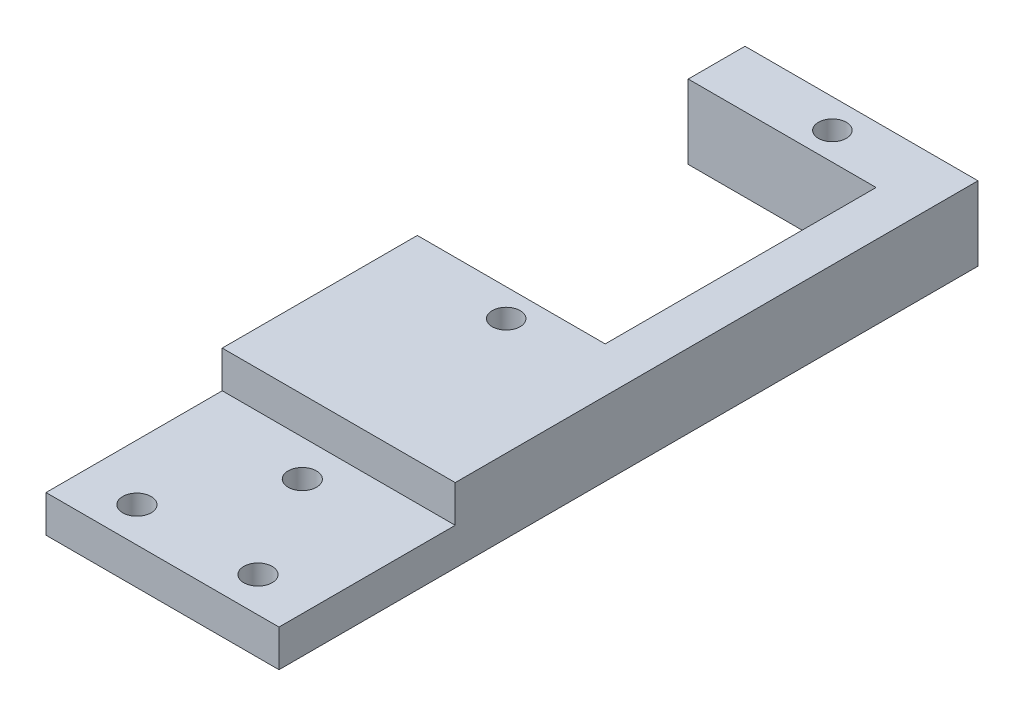
ISO-10303-21;
HEADER;
FILE_DESCRIPTION(('STEP AP214'),'2;1');
FILE_NAME('part.step','',(''),(''),'','','');
FILE_SCHEMA(('AUTOMOTIVE_DESIGN { 1 0 10303 214 1 1 1 1 }'));
ENDSEC;
DATA;
#1=APPLICATION_CONTEXT('core data for automotive mechanical design processes');
#2=APPLICATION_PROTOCOL_DEFINITION('international standard','automotive_design',2000,#1);
#3=PRODUCT_CONTEXT('',#1,'mechanical');
#4=PRODUCT('Part','Part','',(#3));
#5=PRODUCT_RELATED_PRODUCT_CATEGORY('part','',(#4));
#6=PRODUCT_DEFINITION_FORMATION('','',#4);
#7=PRODUCT_DEFINITION_CONTEXT('part definition',#1,'design');
#8=PRODUCT_DEFINITION('design','',#6,#7);
#9=PRODUCT_DEFINITION_SHAPE('','',#8);
#10=(LENGTH_UNIT() NAMED_UNIT(*) SI_UNIT(.MILLI.,.METRE.));
#11=(NAMED_UNIT(*) PLANE_ANGLE_UNIT() SI_UNIT($,.RADIAN.));
#12=(NAMED_UNIT(*) SI_UNIT($,.STERADIAN.) SOLID_ANGLE_UNIT());
#13=UNCERTAINTY_MEASURE_WITH_UNIT(LENGTH_MEASURE(1.E-05),#10,'distance_accuracy_value','');
#14=(GEOMETRIC_REPRESENTATION_CONTEXT(3) GLOBAL_UNCERTAINTY_ASSIGNED_CONTEXT((#13)) GLOBAL_UNIT_ASSIGNED_CONTEXT((#10,
#11,#12)) REPRESENTATION_CONTEXT('',''));
#15=CARTESIAN_POINT('',(0.,0.,0.));
#16=DIRECTION('',(0.,0.,1.));
#17=DIRECTION('',(1.,0.,0.));
#18=AXIS2_PLACEMENT_3D('',#15,#16,#17);
#19=CARTESIAN_POINT('',(0.,6.35,0.));
#20=DIRECTION('',(1.,0.,0.));
#21=DIRECTION('',(0.,0.,-1.));
#22=AXIS2_PLACEMENT_3D('',#19,#20,#21);
#23=PLANE('',#22);
#24=DIRECTION('',(0.,0.,1.));
#25=VECTOR('',#24,1.);
#26=CARTESIAN_POINT('',(0.,0.,0.));
#27=LINE('',#26,#25);
#28=CARTESIAN_POINT('',(0.,0.,0.));
#29=VERTEX_POINT('',#28);
#30=CARTESIAN_POINT('',(0.,0.,4.873));
#31=VERTEX_POINT('',#30);
#32=EDGE_CURVE('E151',#29,#31,#27,.T.);
#33=ORIENTED_EDGE('',*,*,#32,.T.);
#34=DIRECTION('',(0.,1.,0.));
#35=VECTOR('',#34,1.);
#36=CARTESIAN_POINT('',(0.,0.,4.873));
#37=LINE('',#36,#35);
#38=CARTESIAN_POINT('',(0.,6.35,4.873));
#39=VERTEX_POINT('',#38);
#40=EDGE_CURVE('E152',#31,#39,#37,.T.);
#41=ORIENTED_EDGE('',*,*,#40,.T.);
#42=DIRECTION('',(0.,0.,1.));
#43=VECTOR('',#42,1.);
#44=CARTESIAN_POINT('',(0.,6.35,0.));
#45=LINE('',#44,#43);
#46=CARTESIAN_POINT('',(0.,6.35,0.));
#47=VERTEX_POINT('',#46);
#48=EDGE_CURVE('E248',#47,#39,#45,.T.);
#49=ORIENTED_EDGE('',*,*,#48,.F.);
#50=DIRECTION('',(0.,-1.,0.));
#51=VECTOR('',#50,1.);
#52=CARTESIAN_POINT('',(0.,6.35,0.));
#53=LINE('',#52,#51);
#54=EDGE_CURVE('E171',#47,#29,#53,.T.);
#55=ORIENTED_EDGE('',*,*,#54,.T.);
#56=EDGE_LOOP('',(#33,#41,#49,#55));
#57=FACE_BOUND('',#56,.T.);
#58=ADVANCED_FACE('F39',(#57),#23,.F.);
#59=DIRECTION('',(0.,0.,-1.));
#60=VECTOR('',#59,1.);
#61=CARTESIAN_POINT('',(0.,3.175,60.));
#62=LINE('',#61,#60);
#63=CARTESIAN_POINT('',(0.,3.175,60.));
#64=VERTEX_POINT('',#63);
#65=CARTESIAN_POINT('',(0.,3.175,44.873));
#66=VERTEX_POINT('',#65);
#67=EDGE_CURVE('E121',#64,#66,#62,.T.);
#68=ORIENTED_EDGE('',*,*,#67,.T.);
#69=DIRECTION('',(0.,1.,0.));
#70=VECTOR('',#69,1.);
#71=CARTESIAN_POINT('',(0.,6.35,44.873));
#72=LINE('',#71,#70);
#73=CARTESIAN_POINT('',(0.,6.35,44.873));
#74=VERTEX_POINT('',#73);
#75=EDGE_CURVE('E133',#66,#74,#72,.T.);
#76=ORIENTED_EDGE('',*,*,#75,.T.);
#77=CARTESIAN_POINT('',(0.,6.35,28.127));
#78=VERTEX_POINT('',#77);
#79=EDGE_CURVE('E170',#78,#74,#45,.T.);
#80=ORIENTED_EDGE('',*,*,#79,.F.);
#81=DIRECTION('',(0.,1.,0.));
#82=VECTOR('',#81,1.);
#83=CARTESIAN_POINT('',(0.,0.,28.127));
#84=LINE('',#83,#82);
#85=CARTESIAN_POINT('',(0.,0.,28.127));
#86=VERTEX_POINT('',#85);
#87=EDGE_CURVE('E147',#86,#78,#84,.T.);
#88=ORIENTED_EDGE('',*,*,#87,.F.);
#89=CARTESIAN_POINT('',(0.,0.,60.));
#90=VERTEX_POINT('',#89);
#91=EDGE_CURVE('E144',#86,#90,#27,.T.);
#92=ORIENTED_EDGE('',*,*,#91,.T.);
#93=DIRECTION('',(0.,-1.,0.));
#94=VECTOR('',#93,1.);
#95=CARTESIAN_POINT('',(0.,6.35,60.));
#96=LINE('',#95,#94);
#97=EDGE_CURVE('E11',#64,#90,#96,.T.);
#98=ORIENTED_EDGE('',*,*,#97,.F.);
#99=EDGE_LOOP('',(#68,#76,#80,#88,#92,#98));
#100=FACE_BOUND('',#99,.T.);
#101=ADVANCED_FACE('F41',(#100),#23,.F.);
#102=CARTESIAN_POINT('',(0.,6.35,60.));
#103=DIRECTION('',(0.,0.,-1.));
#104=DIRECTION('',(-1.,0.,0.));
#105=AXIS2_PLACEMENT_3D('',#102,#103,#104);
#106=PLANE('',#105);
#107=DIRECTION('',(0.,-1.,0.));
#108=VECTOR('',#107,1.);
#109=CARTESIAN_POINT('',(20.,6.35,60.));
#110=LINE('',#109,#108);
#111=CARTESIAN_POINT('',(20.,3.175,60.));
#112=VERTEX_POINT('',#111);
#113=CARTESIAN_POINT('',(20.,0.,60.));
#114=VERTEX_POINT('',#113);
#115=EDGE_CURVE('E48',#112,#114,#110,.T.);
#116=ORIENTED_EDGE('',*,*,#115,.F.);
#117=DIRECTION('',(1.,0.,0.));
#118=VECTOR('',#117,1.);
#119=CARTESIAN_POINT('',(0.,3.175,60.));
#120=LINE('',#119,#118);
#121=EDGE_CURVE('E125',#64,#112,#120,.T.);
#122=ORIENTED_EDGE('',*,*,#121,.F.);
#123=ORIENTED_EDGE('',*,*,#97,.T.);
#124=DIRECTION('',(1.,0.,0.));
#125=VECTOR('',#124,1.);
#126=CARTESIAN_POINT('',(0.,0.,60.));
#127=LINE('',#126,#125);
#128=EDGE_CURVE('E155',#90,#114,#127,.T.);
#129=ORIENTED_EDGE('',*,*,#128,.T.);
#130=EDGE_LOOP('',(#116,#122,#123,#129));
#131=FACE_BOUND('',#130,.T.);
#132=ADVANCED_FACE('F137',(#131),#106,.F.);
#133=CARTESIAN_POINT('',(20.,6.35,0.));
#134=DIRECTION('',(-1.,0.,0.));
#135=DIRECTION('',(0.,0.,1.));
#136=AXIS2_PLACEMENT_3D('',#133,#134,#135);
#137=PLANE('',#136);
#138=DIRECTION('',(0.,0.,-1.));
#139=VECTOR('',#138,1.);
#140=CARTESIAN_POINT('',(20.,6.35,0.));
#141=LINE('',#140,#139);
#142=CARTESIAN_POINT('',(20.,6.35,44.873));
#143=VERTEX_POINT('',#142);
#144=CARTESIAN_POINT('',(20.,6.35,0.));
#145=VERTEX_POINT('',#144);
#146=EDGE_CURVE('E252',#143,#145,#141,.T.);
#147=ORIENTED_EDGE('',*,*,#146,.F.);
#148=DIRECTION('',(0.,1.,0.));
#149=VECTOR('',#148,1.);
#150=CARTESIAN_POINT('',(20.,6.35,44.873));
#151=LINE('',#150,#149);
#152=CARTESIAN_POINT('',(20.,3.175,44.873));
#153=VERTEX_POINT('',#152);
#154=EDGE_CURVE('E55',#153,#143,#151,.T.);
#155=ORIENTED_EDGE('',*,*,#154,.F.);
#156=DIRECTION('',(0.,0.,-1.));
#157=VECTOR('',#156,1.);
#158=CARTESIAN_POINT('',(20.,3.175,60.));
#159=LINE('',#158,#157);
#160=EDGE_CURVE('E184',#112,#153,#159,.T.);
#161=ORIENTED_EDGE('',*,*,#160,.F.);
#162=ORIENTED_EDGE('',*,*,#115,.T.);
#163=DIRECTION('',(0.,0.,-1.));
#164=VECTOR('',#163,1.);
#165=CARTESIAN_POINT('',(20.,0.,0.));
#166=LINE('',#165,#164);
#167=CARTESIAN_POINT('',(20.,0.,0.));
#168=VERTEX_POINT('',#167);
#169=EDGE_CURVE('E158',#114,#168,#166,.T.);
#170=ORIENTED_EDGE('',*,*,#169,.T.);
#171=DIRECTION('',(0.,-1.,0.));
#172=VECTOR('',#171,1.);
#173=CARTESIAN_POINT('',(20.,6.35,0.));
#174=LINE('',#173,#172);
#175=EDGE_CURVE('E175',#145,#168,#174,.T.);
#176=ORIENTED_EDGE('',*,*,#175,.F.);
#177=EDGE_LOOP('',(#147,#155,#161,#162,#170,#176));
#178=FACE_BOUND('',#177,.T.);
#179=ADVANCED_FACE('F182',(#178),#137,.F.);
#180=CARTESIAN_POINT('',(0.,6.35,0.));
#181=DIRECTION('',(0.,0.,1.));
#182=DIRECTION('',(1.,0.,0.));
#183=AXIS2_PLACEMENT_3D('',#180,#181,#182);
#184=PLANE('',#183);
#185=DIRECTION('',(-1.,0.,0.));
#186=VECTOR('',#185,1.);
#187=CARTESIAN_POINT('',(0.,0.,0.));
#188=LINE('',#187,#186);
#189=EDGE_CURVE('E163',#168,#29,#188,.T.);
#190=ORIENTED_EDGE('',*,*,#189,.T.);
#191=ORIENTED_EDGE('',*,*,#54,.F.);
#192=DIRECTION('',(-1.,0.,0.));
#193=VECTOR('',#192,1.);
#194=CARTESIAN_POINT('',(0.,6.35,0.));
#195=LINE('',#194,#193);
#196=EDGE_CURVE('E176',#145,#47,#195,.T.);
#197=ORIENTED_EDGE('',*,*,#196,.F.);
#198=ORIENTED_EDGE('',*,*,#175,.T.);
#199=EDGE_LOOP('',(#190,#191,#197,#198));
#200=FACE_BOUND('',#199,.T.);
#201=ADVANCED_FACE('F263',(#200),#184,.F.);
#202=CARTESIAN_POINT('',(0.,6.35,0.));
#203=DIRECTION('',(0.,1.,0.));
#204=DIRECTION('',(0.,0.,1.));
#205=AXIS2_PLACEMENT_3D('',#202,#203,#204);
#206=PLANE('',#205);
#207=DIRECTION('',(1.,0.,0.));
#208=VECTOR('',#207,1.);
#209=CARTESIAN_POINT('',(0.,6.35,44.873));
#210=LINE('',#209,#208);
#211=EDGE_CURVE('E196',#74,#143,#210,.T.);
#212=ORIENTED_EDGE('',*,*,#211,.T.);
#213=ORIENTED_EDGE('',*,*,#146,.T.);
#214=ORIENTED_EDGE('',*,*,#196,.T.);
#215=ORIENTED_EDGE('',*,*,#48,.T.);
#216=DIRECTION('',(-1.,0.,0.));
#217=VECTOR('',#216,1.);
#218=CARTESIAN_POINT('',(0.,6.35,4.873));
#219=LINE('',#218,#217);
#220=CARTESIAN_POINT('',(16.127,6.35,4.873));
#221=VERTEX_POINT('',#220);
#222=EDGE_CURVE('E221',#221,#39,#219,.T.);
#223=ORIENTED_EDGE('',*,*,#222,.F.);
#224=DIRECTION('',(0.,0.,-1.));
#225=VECTOR('',#224,1.);
#226=CARTESIAN_POINT('',(16.127,6.35,4.873));
#227=LINE('',#226,#225);
#228=CARTESIAN_POINT('',(16.127,6.35,28.127));
#229=VERTEX_POINT('',#228);
#230=EDGE_CURVE('E231',#229,#221,#227,.T.);
#231=ORIENTED_EDGE('',*,*,#230,.F.);
#232=DIRECTION('',(1.,0.,0.));
#233=VECTOR('',#232,1.);
#234=CARTESIAN_POINT('',(0.,6.35,28.127));
#235=LINE('',#234,#233);
#236=EDGE_CURVE('E217',#78,#229,#235,.T.);
#237=ORIENTED_EDGE('',*,*,#236,.F.);
#238=ORIENTED_EDGE('',*,*,#79,.T.);
#239=EDGE_LOOP('',(#212,#213,#214,#215,#223,#231,#237,#238));
#240=FACE_BOUND('',#239,.T.);
#241=CARTESIAN_POINT('',(10.,6.35,2.5));
#242=DIRECTION('',(0.,1.,0.));
#243=DIRECTION('',(0.,0.,1.));
#244=AXIS2_PLACEMENT_3D('',#241,#242,#243);
#245=CIRCLE('',#244,1.19999999999999);
#246=CARTESIAN_POINT('',(10.,6.35,3.69999999999999));
#247=VERTEX_POINT('',#246);
#248=EDGE_CURVE('E199',#247,#247,#245,.T.);
#249=ORIENTED_EDGE('',*,*,#248,.F.);
#250=EDGE_LOOP('',(#249));
#251=FACE_BOUND('',#250,.T.);
#252=CARTESIAN_POINT('',(10.,6.35,30.5));
#253=DIRECTION('',(0.,1.,0.));
#254=DIRECTION('',(0.,0.,1.));
#255=AXIS2_PLACEMENT_3D('',#252,#253,#254);
#256=CIRCLE('',#255,1.19999999999999);
#257=CARTESIAN_POINT('',(10.,6.35,31.7));
#258=VERTEX_POINT('',#257);
#259=EDGE_CURVE('E209',#258,#258,#256,.T.);
#260=ORIENTED_EDGE('',*,*,#259,.F.);
#261=EDGE_LOOP('',(#260));
#262=FACE_BOUND('',#261,.T.);
#263=ADVANCED_FACE('F258',(#240,#251,#262),#206,.T.);
#264=CARTESIAN_POINT('',(0.,0.,0.));
#265=DIRECTION('',(0.,1.,0.));
#266=DIRECTION('',(0.,0.,1.));
#267=AXIS2_PLACEMENT_3D('',#264,#265,#266);
#268=PLANE('',#267);
#269=CARTESIAN_POINT('',(9.99999999999999,0.,48.));
#270=DIRECTION('',(0.,1.,0.));
#271=DIRECTION('',(0.,0.,1.));
#272=AXIS2_PLACEMENT_3D('',#269,#270,#271);
#273=CIRCLE('',#272,1.2192);
#274=CARTESIAN_POINT('',(9.99999999999999,0.,49.2192));
#275=VERTEX_POINT('',#274);
#276=EDGE_CURVE('E415',#275,#275,#273,.T.);
#277=ORIENTED_EDGE('',*,*,#276,.T.);
#278=EDGE_LOOP('',(#277));
#279=FACE_BOUND('',#278,.T.);
#280=CARTESIAN_POINT('',(4.80384757729337,0.,57.));
#281=DIRECTION('',(0.,1.,0.));
#282=DIRECTION('',(0.,0.,1.));
#283=AXIS2_PLACEMENT_3D('',#280,#281,#282);
#284=CIRCLE('',#283,1.2192);
#285=CARTESIAN_POINT('',(4.80384757729337,0.,58.2192));
#286=VERTEX_POINT('',#285);
#287=EDGE_CURVE('E428',#286,#286,#284,.T.);
#288=ORIENTED_EDGE('',*,*,#287,.T.);
#289=EDGE_LOOP('',(#288));
#290=FACE_BOUND('',#289,.T.);
#291=CARTESIAN_POINT('',(15.1961524227066,0.,57.));
#292=DIRECTION('',(0.,1.,0.));
#293=DIRECTION('',(0.,0.,1.));
#294=AXIS2_PLACEMENT_3D('',#291,#292,#293);
#295=CIRCLE('',#294,1.2192);
#296=CARTESIAN_POINT('',(15.1961524227066,0.,58.2192));
#297=VERTEX_POINT('',#296);
#298=EDGE_CURVE('E186',#297,#297,#295,.T.);
#299=ORIENTED_EDGE('',*,*,#298,.T.);
#300=EDGE_LOOP('',(#299));
#301=FACE_BOUND('',#300,.T.);
#302=DIRECTION('',(0.,0.,-1.));
#303=VECTOR('',#302,1.);
#304=CARTESIAN_POINT('',(16.127,0.,4.873));
#305=LINE('',#304,#303);
#306=CARTESIAN_POINT('',(16.127,0.,28.127));
#307=VERTEX_POINT('',#306);
#308=CARTESIAN_POINT('',(16.127,0.,4.873));
#309=VERTEX_POINT('',#308);
#310=EDGE_CURVE('E63',#307,#309,#305,.T.);
#311=ORIENTED_EDGE('',*,*,#310,.T.);
#312=DIRECTION('',(-1.,0.,0.));
#313=VECTOR('',#312,1.);
#314=CARTESIAN_POINT('',(0.,0.,4.873));
#315=LINE('',#314,#313);
#316=EDGE_CURVE('E224',#309,#31,#315,.T.);
#317=ORIENTED_EDGE('',*,*,#316,.T.);
#318=ORIENTED_EDGE('',*,*,#32,.F.);
#319=ORIENTED_EDGE('',*,*,#189,.F.);
#320=ORIENTED_EDGE('',*,*,#169,.F.);
#321=ORIENTED_EDGE('',*,*,#128,.F.);
#322=ORIENTED_EDGE('',*,*,#91,.F.);
#323=DIRECTION('',(1.,0.,0.));
#324=VECTOR('',#323,1.);
#325=CARTESIAN_POINT('',(0.,0.,28.127));
#326=LINE('',#325,#324);
#327=EDGE_CURVE('E218',#86,#307,#326,.T.);
#328=ORIENTED_EDGE('',*,*,#327,.T.);
#329=EDGE_LOOP('',(#311,#317,#318,#319,#320,#321,#322,#328));
#330=FACE_BOUND('',#329,.T.);
#331=ADVANCED_FACE('F156',(#279,#290,#301,#330),#268,.F.);
#332=CARTESIAN_POINT('',(0.,0.,4.873));
#333=DIRECTION('',(0.,0.,-1.));
#334=DIRECTION('',(-1.,0.,0.));
#335=AXIS2_PLACEMENT_3D('',#332,#333,#334);
#336=PLANE('',#335);
#337=ORIENTED_EDGE('',*,*,#222,.T.);
#338=ORIENTED_EDGE('',*,*,#40,.F.);
#339=ORIENTED_EDGE('',*,*,#316,.F.);
#340=DIRECTION('',(0.,1.,0.));
#341=VECTOR('',#340,1.);
#342=CARTESIAN_POINT('',(16.127,0.,4.873));
#343=LINE('',#342,#341);
#344=EDGE_CURVE('E240',#309,#221,#343,.T.);
#345=ORIENTED_EDGE('',*,*,#344,.T.);
#346=EDGE_LOOP('',(#337,#338,#339,#345));
#347=FACE_BOUND('',#346,.T.);
#348=ADVANCED_FACE('F268',(#347),#336,.F.);
#349=CARTESIAN_POINT('',(16.127,0.,4.873));
#350=DIRECTION('',(1.,0.,0.));
#351=DIRECTION('',(0.,0.,-1.));
#352=AXIS2_PLACEMENT_3D('',#349,#350,#351);
#353=PLANE('',#352);
#354=ORIENTED_EDGE('',*,*,#230,.T.);
#355=ORIENTED_EDGE('',*,*,#344,.F.);
#356=ORIENTED_EDGE('',*,*,#310,.F.);
#357=DIRECTION('',(0.,1.,0.));
#358=VECTOR('',#357,1.);
#359=CARTESIAN_POINT('',(16.127,0.,28.127));
#360=LINE('',#359,#358);
#361=EDGE_CURVE('E243',#307,#229,#360,.T.);
#362=ORIENTED_EDGE('',*,*,#361,.T.);
#363=EDGE_LOOP('',(#354,#355,#356,#362));
#364=FACE_BOUND('',#363,.T.);
#365=ADVANCED_FACE('F273',(#364),#353,.F.);
#366=CARTESIAN_POINT('',(0.,0.,28.127));
#367=DIRECTION('',(0.,0.,1.));
#368=DIRECTION('',(1.,0.,0.));
#369=AXIS2_PLACEMENT_3D('',#366,#367,#368);
#370=PLANE('',#369);
#371=ORIENTED_EDGE('',*,*,#236,.T.);
#372=ORIENTED_EDGE('',*,*,#361,.F.);
#373=ORIENTED_EDGE('',*,*,#327,.F.);
#374=ORIENTED_EDGE('',*,*,#87,.T.);
#375=EDGE_LOOP('',(#371,#372,#373,#374));
#376=FACE_BOUND('',#375,.T.);
#377=ADVANCED_FACE('F270',(#376),#370,.F.);
#378=CARTESIAN_POINT('',(10.,1.35,30.5));
#379=DIRECTION('',(0.,1.,0.));
#380=DIRECTION('',(0.,0.,1.));
#381=AXIS2_PLACEMENT_3D('',#378,#379,#380);
#382=CONICAL_SURFACE('',#381,1.19999999999999,1.02974425867665);
#383=CARTESIAN_POINT('',(10.,0.628967257166926,30.5));
#384=VERTEX_POINT('',#383);
#385=VERTEX_LOOP('',#384);
#386=FACE_BOUND('',#385,.T.);
#387=CARTESIAN_POINT('',(10.,1.35,30.5));
#388=DIRECTION('',(0.,1.,0.));
#389=DIRECTION('',(0.,0.,1.));
#390=AXIS2_PLACEMENT_3D('',#387,#388,#389);
#391=CIRCLE('',#390,1.19999999999999);
#392=CARTESIAN_POINT('',(10.,1.35,31.7));
#393=VERTEX_POINT('',#392);
#394=EDGE_CURVE('E213',#393,#393,#391,.T.);
#395=ORIENTED_EDGE('',*,*,#394,.T.);
#396=EDGE_LOOP('',(#395));
#397=FACE_BOUND('',#396,.T.);
#398=ADVANCED_FACE('F313',(#386,#397),#382,.F.);
#399=CARTESIAN_POINT('',(10.,6.35,30.5));
#400=DIRECTION('',(0.,1.,0.));
#401=DIRECTION('',(0.,0.,1.));
#402=AXIS2_PLACEMENT_3D('',#399,#400,#401);
#403=CYLINDRICAL_SURFACE('',#402,1.19999999999999);
#404=ORIENTED_EDGE('',*,*,#394,.F.);
#405=EDGE_LOOP('',(#404));
#406=FACE_BOUND('',#405,.T.);
#407=ORIENTED_EDGE('',*,*,#259,.T.);
#408=EDGE_LOOP('',(#407));
#409=FACE_BOUND('',#408,.T.);
#410=ADVANCED_FACE('F320',(#406,#409),#403,.F.);
#411=CARTESIAN_POINT('',(10.,1.35,2.5));
#412=DIRECTION('',(0.,1.,0.));
#413=DIRECTION('',(0.,0.,1.));
#414=AXIS2_PLACEMENT_3D('',#411,#412,#413);
#415=CONICAL_SURFACE('',#414,1.19999999999999,1.02974425867665);
#416=CARTESIAN_POINT('',(10.,0.628967257166926,2.5));
#417=VERTEX_POINT('',#416);
#418=VERTEX_LOOP('',#417);
#419=FACE_BOUND('',#418,.T.);
#420=CARTESIAN_POINT('',(10.,1.35,2.5));
#421=DIRECTION('',(0.,1.,0.));
#422=DIRECTION('',(0.,0.,1.));
#423=AXIS2_PLACEMENT_3D('',#420,#421,#422);
#424=CIRCLE('',#423,1.19999999999999);
#425=CARTESIAN_POINT('',(10.,1.35,3.69999999999999));
#426=VERTEX_POINT('',#425);
#427=EDGE_CURVE('E205',#426,#426,#424,.T.);
#428=ORIENTED_EDGE('',*,*,#427,.T.);
#429=EDGE_LOOP('',(#428));
#430=FACE_BOUND('',#429,.T.);
#431=ADVANCED_FACE('F288',(#419,#430),#415,.F.);
#432=CARTESIAN_POINT('',(10.,6.35,2.5));
#433=DIRECTION('',(0.,1.,0.));
#434=DIRECTION('',(0.,0.,1.));
#435=AXIS2_PLACEMENT_3D('',#432,#433,#434);
#436=CYLINDRICAL_SURFACE('',#435,1.19999999999999);
#437=ORIENTED_EDGE('',*,*,#427,.F.);
#438=EDGE_LOOP('',(#437));
#439=FACE_BOUND('',#438,.T.);
#440=ORIENTED_EDGE('',*,*,#248,.T.);
#441=EDGE_LOOP('',(#440));
#442=FACE_BOUND('',#441,.T.);
#443=ADVANCED_FACE('F279',(#439,#442),#436,.F.);
#444=CARTESIAN_POINT('',(0.,6.35,44.873));
#445=DIRECTION('',(0.,0.,-1.));
#446=DIRECTION('',(-1.,0.,0.));
#447=AXIS2_PLACEMENT_3D('',#444,#445,#446);
#448=PLANE('',#447);
#449=ORIENTED_EDGE('',*,*,#154,.T.);
#450=ORIENTED_EDGE('',*,*,#211,.F.);
#451=ORIENTED_EDGE('',*,*,#75,.F.);
#452=DIRECTION('',(1.,0.,0.));
#453=VECTOR('',#452,1.);
#454=CARTESIAN_POINT('',(0.,3.175,44.873));
#455=LINE('',#454,#453);
#456=EDGE_CURVE('E127',#66,#153,#455,.T.);
#457=ORIENTED_EDGE('',*,*,#456,.T.);
#458=EDGE_LOOP('',(#449,#450,#451,#457));
#459=FACE_BOUND('',#458,.T.);
#460=ADVANCED_FACE('F277',(#459),#448,.F.);
#461=CARTESIAN_POINT('',(0.,3.175,60.));
#462=DIRECTION('',(0.,-1.,0.));
#463=DIRECTION('',(0.,0.,-1.));
#464=AXIS2_PLACEMENT_3D('',#461,#462,#463);
#465=PLANE('',#464);
#466=CARTESIAN_POINT('',(9.99999999999999,3.175,48.));
#467=DIRECTION('',(0.,1.,0.));
#468=DIRECTION('',(0.,0.,1.));
#469=AXIS2_PLACEMENT_3D('',#466,#467,#468);
#470=CIRCLE('',#469,1.21919999999999);
#471=CARTESIAN_POINT('',(9.99999999999999,3.175,49.2192));
#472=VERTEX_POINT('',#471);
#473=EDGE_CURVE('E418',#472,#472,#470,.T.);
#474=ORIENTED_EDGE('',*,*,#473,.F.);
#475=EDGE_LOOP('',(#474));
#476=FACE_BOUND('',#475,.T.);
#477=CARTESIAN_POINT('',(4.80384757729337,3.175,57.));
#478=DIRECTION('',(0.,1.,0.));
#479=DIRECTION('',(0.,0.,1.));
#480=AXIS2_PLACEMENT_3D('',#477,#478,#479);
#481=CIRCLE('',#480,1.21919999999999);
#482=CARTESIAN_POINT('',(4.80384757729337,3.175,58.2192));
#483=VERTEX_POINT('',#482);
#484=EDGE_CURVE('E422',#483,#483,#481,.T.);
#485=ORIENTED_EDGE('',*,*,#484,.F.);
#486=EDGE_LOOP('',(#485));
#487=FACE_BOUND('',#486,.T.);
#488=CARTESIAN_POINT('',(15.1961524227066,3.175,57.));
#489=DIRECTION('',(0.,1.,0.));
#490=DIRECTION('',(0.,0.,1.));
#491=AXIS2_PLACEMENT_3D('',#488,#489,#490);
#492=CIRCLE('',#491,1.21919999999999);
#493=CARTESIAN_POINT('',(15.1961524227066,3.175,58.2192));
#494=VERTEX_POINT('',#493);
#495=EDGE_CURVE('E192',#494,#494,#492,.T.);
#496=ORIENTED_EDGE('',*,*,#495,.F.);
#497=EDGE_LOOP('',(#496));
#498=FACE_BOUND('',#497,.T.);
#499=ORIENTED_EDGE('',*,*,#160,.T.);
#500=ORIENTED_EDGE('',*,*,#456,.F.);
#501=ORIENTED_EDGE('',*,*,#67,.F.);
#502=ORIENTED_EDGE('',*,*,#121,.T.);
#503=EDGE_LOOP('',(#499,#500,#501,#502));
#504=FACE_BOUND('',#503,.T.);
#505=ADVANCED_FACE('F124',(#476,#487,#498,#504),#465,.F.);
#506=CARTESIAN_POINT('',(15.1961524227066,3.175,57.));
#507=DIRECTION('',(0.,1.,0.));
#508=DIRECTION('',(0.,0.,1.));
#509=AXIS2_PLACEMENT_3D('',#506,#507,#508);
#510=CYLINDRICAL_SURFACE('',#509,1.21919999999999);
#511=ORIENTED_EDGE('',*,*,#298,.F.);
#512=EDGE_LOOP('',(#511));
#513=FACE_BOUND('',#512,.T.);
#514=ORIENTED_EDGE('',*,*,#495,.T.);
#515=EDGE_LOOP('',(#514));
#516=FACE_BOUND('',#515,.T.);
#517=ADVANCED_FACE('F285',(#513,#516),#510,.F.);
#518=CARTESIAN_POINT('',(4.80384757729337,3.175,57.));
#519=DIRECTION('',(0.,1.,0.));
#520=DIRECTION('',(0.,0.,1.));
#521=AXIS2_PLACEMENT_3D('',#518,#519,#520);
#522=CYLINDRICAL_SURFACE('',#521,1.21919999999999);
#523=ORIENTED_EDGE('',*,*,#287,.F.);
#524=EDGE_LOOP('',(#523));
#525=FACE_BOUND('',#524,.T.);
#526=ORIENTED_EDGE('',*,*,#484,.T.);
#527=EDGE_LOOP('',(#526));
#528=FACE_BOUND('',#527,.T.);
#529=ADVANCED_FACE('F389',(#525,#528),#522,.F.);
#530=CARTESIAN_POINT('',(9.99999999999999,3.175,48.));
#531=DIRECTION('',(0.,1.,0.));
#532=DIRECTION('',(0.,0.,1.));
#533=AXIS2_PLACEMENT_3D('',#530,#531,#532);
#534=CYLINDRICAL_SURFACE('',#533,1.21919999999999);
#535=ORIENTED_EDGE('',*,*,#276,.F.);
#536=EDGE_LOOP('',(#535));
#537=FACE_BOUND('',#536,.T.);
#538=ORIENTED_EDGE('',*,*,#473,.T.);
#539=EDGE_LOOP('',(#538));
#540=FACE_BOUND('',#539,.T.);
#541=ADVANCED_FACE('F398',(#537,#540),#534,.F.);
#542=CLOSED_SHELL('',(#58,#101,#132,#179,#201,#263,#331,#348,#365,#377,#398,#410,#431,#443,#460,
#505,#517,#529,#541));
#543=MANIFOLD_SOLID_BREP('B2',#542);
#544=ADVANCED_BREP_SHAPE_REPRESENTATION('',(#18,#543),#14);
#545=SHAPE_DEFINITION_REPRESENTATION(#9,#544);
ENDSEC;
END-ISO-10303-21;
